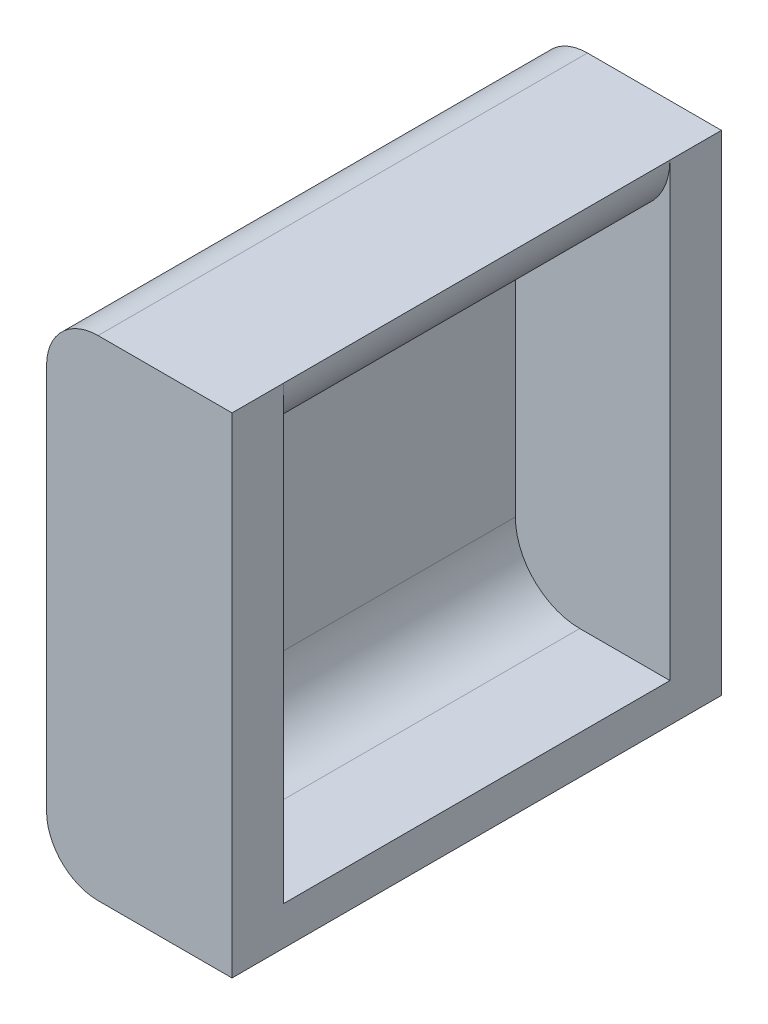
ISO-10303-21;
HEADER;
FILE_DESCRIPTION(('STEP AP214'),'2;1');
FILE_NAME('part.step','',(''),(''),'','','');
FILE_SCHEMA(('AUTOMOTIVE_DESIGN { 1 0 10303 214 1 1 1 1 }'));
ENDSEC;
DATA;
#1=APPLICATION_CONTEXT('core data for automotive mechanical design processes');
#2=APPLICATION_PROTOCOL_DEFINITION('international standard','automotive_design',2000,#1);
#3=PRODUCT_CONTEXT('',#1,'mechanical');
#4=PRODUCT('Part','Part','',(#3));
#5=PRODUCT_RELATED_PRODUCT_CATEGORY('part','',(#4));
#6=PRODUCT_DEFINITION_FORMATION('','',#4);
#7=PRODUCT_DEFINITION_CONTEXT('part definition',#1,'design');
#8=PRODUCT_DEFINITION('design','',#6,#7);
#9=PRODUCT_DEFINITION_SHAPE('','',#8);
#10=(LENGTH_UNIT() NAMED_UNIT(*) SI_UNIT(.MILLI.,.METRE.));
#11=(NAMED_UNIT(*) PLANE_ANGLE_UNIT() SI_UNIT($,.RADIAN.));
#12=(NAMED_UNIT(*) SI_UNIT($,.STERADIAN.) SOLID_ANGLE_UNIT());
#13=UNCERTAINTY_MEASURE_WITH_UNIT(LENGTH_MEASURE(1.E-05),#10,'distance_accuracy_value','');
#14=(GEOMETRIC_REPRESENTATION_CONTEXT(3) GLOBAL_UNCERTAINTY_ASSIGNED_CONTEXT((#13)) GLOBAL_UNIT_ASSIGNED_CONTEXT((#10,
#11,#12)) REPRESENTATION_CONTEXT('',''));
#15=CARTESIAN_POINT('',(0.,0.,0.));
#16=DIRECTION('',(0.,0.,1.));
#17=DIRECTION('',(1.,0.,0.));
#18=AXIS2_PLACEMENT_3D('',#15,#16,#17);
#19=CARTESIAN_POINT('',(-24.257,-43.6245,-19.05));
#20=DIRECTION('',(0.,0.,1.));
#21=DIRECTION('',(1.,0.,0.));
#22=AXIS2_PLACEMENT_3D('',#19,#20,#21);
#23=CYLINDRICAL_SURFACE('',#22,3.175);
#24=CARTESIAN_POINT('',(-24.257,-43.6245,0.));
#25=DIRECTION('',(0.,0.,1.));
#26=DIRECTION('',(1.,0.,0.));
#27=AXIS2_PLACEMENT_3D('',#24,#25,#26);
#28=CIRCLE('',#27,3.175);
#29=CARTESIAN_POINT('',(-27.432,-43.6245,0.));
#30=VERTEX_POINT('',#29);
#31=CARTESIAN_POINT('',(-24.257,-46.7995,0.));
#32=VERTEX_POINT('',#31);
#33=EDGE_CURVE('E221',#30,#32,#28,.T.);
#34=ORIENTED_EDGE('',*,*,#33,.T.);
#35=DIRECTION('',(0.,0.,1.));
#36=VECTOR('',#35,1.);
#37=CARTESIAN_POINT('',(-24.257,-46.7995,-19.05));
#38=LINE('',#37,#36);
#39=CARTESIAN_POINT('',(-24.257,-46.7995,-19.05));
#40=VERTEX_POINT('',#39);
#41=EDGE_CURVE('E268',#40,#32,#38,.T.);
#42=ORIENTED_EDGE('',*,*,#41,.F.);
#43=CARTESIAN_POINT('',(-24.257,-43.6245,-19.05));
#44=DIRECTION('',(0.,0.,1.));
#45=DIRECTION('',(1.,0.,0.));
#46=AXIS2_PLACEMENT_3D('',#43,#44,#45);
#47=CIRCLE('',#46,3.175);
#48=CARTESIAN_POINT('',(-27.432,-43.6245,-19.05));
#49=VERTEX_POINT('',#48);
#50=EDGE_CURVE('E222',#49,#40,#47,.T.);
#51=ORIENTED_EDGE('',*,*,#50,.F.);
#52=DIRECTION('',(0.,0.,1.));
#53=VECTOR('',#52,1.);
#54=CARTESIAN_POINT('',(-27.432,-43.6245,-19.05));
#55=LINE('',#54,#53);
#56=EDGE_CURVE('E246',#49,#30,#55,.T.);
#57=ORIENTED_EDGE('',*,*,#56,.T.);
#58=EDGE_LOOP('',(#34,#42,#51,#57));
#59=FACE_BOUND('',#58,.T.);
#60=ADVANCED_FACE('F42',(#59),#23,.F.);
#61=CARTESIAN_POINT('',(0.,-46.7995,-19.05));
#62=DIRECTION('',(0.,-1.,0.));
#63=DIRECTION('',(0.,0.,-1.));
#64=AXIS2_PLACEMENT_3D('',#61,#62,#63);
#65=PLANE('',#64);
#66=DIRECTION('',(1.,0.,0.));
#67=VECTOR('',#66,1.);
#68=CARTESIAN_POINT('',(0.,-46.7995,0.));
#69=LINE('',#68,#67);
#70=CARTESIAN_POINT('',(-19.812,-46.7995,0.));
#71=VERTEX_POINT('',#70);
#72=EDGE_CURVE('E226',#32,#71,#69,.T.);
#73=ORIENTED_EDGE('',*,*,#72,.T.);
#74=DIRECTION('',(0.,0.,1.));
#75=VECTOR('',#74,1.);
#76=CARTESIAN_POINT('',(-19.812,-46.7995,-19.05));
#77=LINE('',#76,#75);
#78=CARTESIAN_POINT('',(-19.812,-46.7995,-19.05));
#79=VERTEX_POINT('',#78);
#80=EDGE_CURVE('E174',#79,#71,#77,.T.);
#81=ORIENTED_EDGE('',*,*,#80,.F.);
#82=DIRECTION('',(1.,0.,0.));
#83=VECTOR('',#82,1.);
#84=CARTESIAN_POINT('',(0.,-46.7995,-19.05));
#85=LINE('',#84,#83);
#86=EDGE_CURVE('E242',#40,#79,#85,.T.);
#87=ORIENTED_EDGE('',*,*,#86,.F.);
#88=ORIENTED_EDGE('',*,*,#41,.T.);
#89=EDGE_LOOP('',(#73,#81,#87,#88));
#90=FACE_BOUND('',#89,.T.);
#91=ADVANCED_FACE('F333',(#90),#65,.F.);
#92=CARTESIAN_POINT('',(-19.812,0.,-19.05));
#93=DIRECTION('',(-1.,0.,0.));
#94=DIRECTION('',(0.,-1.,0.));
#95=AXIS2_PLACEMENT_3D('',#92,#93,#94);
#96=PLANE('',#95);
#97=ORIENTED_EDGE('',*,*,#80,.T.);
#98=DIRECTION('',(0.,1.,0.));
#99=VECTOR('',#98,1.);
#100=CARTESIAN_POINT('',(-19.812,0.,0.));
#101=LINE('',#100,#99);
#102=CARTESIAN_POINT('',(-19.812,-24.5745,0.));
#103=VERTEX_POINT('',#102);
#104=EDGE_CURVE('E200',#71,#103,#101,.T.);
#105=ORIENTED_EDGE('',*,*,#104,.T.);
#106=DIRECTION('',(0.,0.,-1.));
#107=VECTOR('',#106,1.);
#108=CARTESIAN_POINT('',(-19.812,-24.5745,2.54));
#109=LINE('',#108,#107);
#110=CARTESIAN_POINT('',(-19.812,-24.5745,2.54));
#111=VERTEX_POINT('',#110);
#112=EDGE_CURVE('E214',#111,#103,#109,.T.);
#113=ORIENTED_EDGE('',*,*,#112,.F.);
#114=DIRECTION('',(0.,1.,0.));
#115=VECTOR('',#114,1.);
#116=CARTESIAN_POINT('',(-19.812,0.,2.54));
#117=LINE('',#116,#115);
#118=CARTESIAN_POINT('',(-19.812,-48.7045,2.54));
#119=VERTEX_POINT('',#118);
#120=EDGE_CURVE('E172',#119,#111,#117,.T.);
#121=ORIENTED_EDGE('',*,*,#120,.F.);
#122=DIRECTION('',(0.,0.,1.));
#123=VECTOR('',#122,1.);
#124=CARTESIAN_POINT('',(-19.812,-48.7045,-19.05));
#125=LINE('',#124,#123);
#126=CARTESIAN_POINT('',(-19.812,-48.7045,-21.59));
#127=VERTEX_POINT('',#126);
#128=EDGE_CURVE('E164',#127,#119,#125,.T.);
#129=ORIENTED_EDGE('',*,*,#128,.F.);
#130=DIRECTION('',(0.,-1.,0.));
#131=VECTOR('',#130,1.);
#132=CARTESIAN_POINT('',(-19.812,0.,-21.59));
#133=LINE('',#132,#131);
#134=CARTESIAN_POINT('',(-19.812,-24.5745,-21.59));
#135=VERTEX_POINT('',#134);
#136=EDGE_CURVE('E169',#135,#127,#133,.T.);
#137=ORIENTED_EDGE('',*,*,#136,.F.);
#138=DIRECTION('',(0.,0.,1.));
#139=VECTOR('',#138,1.);
#140=CARTESIAN_POINT('',(-19.812,-24.5745,-21.59));
#141=LINE('',#140,#139);
#142=CARTESIAN_POINT('',(-19.812,-24.5745,-19.05));
#143=VERTEX_POINT('',#142);
#144=EDGE_CURVE('E196',#135,#143,#141,.T.);
#145=ORIENTED_EDGE('',*,*,#144,.T.);
#146=DIRECTION('',(0.,-1.,0.));
#147=VECTOR('',#146,1.);
#148=CARTESIAN_POINT('',(-19.812,0.,-19.05));
#149=LINE('',#148,#147);
#150=EDGE_CURVE('E186',#143,#79,#149,.T.);
#151=ORIENTED_EDGE('',*,*,#150,.T.);
#152=EDGE_LOOP('',(#97,#105,#113,#121,#129,#137,#145,#151));
#153=FACE_BOUND('',#152,.T.);
#154=ADVANCED_FACE('F166',(#153),#96,.F.);
#155=CARTESIAN_POINT('',(0.,-48.7045,-19.05));
#156=DIRECTION('',(0.,1.,0.));
#157=DIRECTION('',(0.,0.,1.));
#158=AXIS2_PLACEMENT_3D('',#155,#156,#157);
#159=PLANE('',#158);
#160=DIRECTION('',(1.,0.,0.));
#161=VECTOR('',#160,1.);
#162=CARTESIAN_POINT('',(0.,-48.7045,2.54));
#163=LINE('',#162,#161);
#164=CARTESIAN_POINT('',(-26.416,-48.7045,2.54));
#165=VERTEX_POINT('',#164);
#166=EDGE_CURVE('E211',#165,#119,#163,.T.);
#167=ORIENTED_EDGE('',*,*,#166,.F.);
#168=DIRECTION('',(0.,0.,1.));
#169=VECTOR('',#168,1.);
#170=CARTESIAN_POINT('',(-26.416,-48.7045,-19.05));
#171=LINE('',#170,#169);
#172=CARTESIAN_POINT('',(-26.416,-48.7045,-21.59));
#173=VERTEX_POINT('',#172);
#174=EDGE_CURVE('E69',#165,#173,#171,.F.);
#175=ORIENTED_EDGE('',*,*,#174,.T.);
#176=DIRECTION('',(-1.,0.,0.));
#177=VECTOR('',#176,1.);
#178=CARTESIAN_POINT('',(0.,-48.7045,-21.59));
#179=LINE('',#178,#177);
#180=EDGE_CURVE('E177',#127,#173,#179,.T.);
#181=ORIENTED_EDGE('',*,*,#180,.F.);
#182=ORIENTED_EDGE('',*,*,#128,.T.);
#183=EDGE_LOOP('',(#167,#175,#181,#182));
#184=FACE_BOUND('',#183,.T.);
#185=ADVANCED_FACE('F178',(#184),#159,.F.);
#186=CARTESIAN_POINT('',(-28.956,0.,-19.05));
#187=DIRECTION('',(1.,0.,0.));
#188=DIRECTION('',(0.,0.,-1.));
#189=AXIS2_PLACEMENT_3D('',#186,#187,#188);
#190=PLANE('',#189);
#191=DIRECTION('',(0.,1.,0.));
#192=VECTOR('',#191,1.);
#193=CARTESIAN_POINT('',(-28.956,0.,-21.59));
#194=LINE('',#193,#192);
#195=CARTESIAN_POINT('',(-28.956,-46.1645,-21.59));
#196=VERTEX_POINT('',#195);
#197=CARTESIAN_POINT('',(-28.956,-27.1145,-21.59));
#198=VERTEX_POINT('',#197);
#199=EDGE_CURVE('E180',#196,#198,#194,.T.);
#200=ORIENTED_EDGE('',*,*,#199,.F.);
#201=DIRECTION('',(0.,0.,1.));
#202=VECTOR('',#201,1.);
#203=CARTESIAN_POINT('',(-28.956,-46.1645,-19.05));
#204=LINE('',#203,#202);
#205=CARTESIAN_POINT('',(-28.956,-46.1645,2.54));
#206=VERTEX_POINT('',#205);
#207=EDGE_CURVE('E295',#196,#206,#204,.T.);
#208=ORIENTED_EDGE('',*,*,#207,.T.);
#209=DIRECTION('',(0.,-1.,0.));
#210=VECTOR('',#209,1.);
#211=CARTESIAN_POINT('',(-28.956,0.,2.54));
#212=LINE('',#211,#210);
#213=CARTESIAN_POINT('',(-28.956,-27.1145,2.54));
#214=VERTEX_POINT('',#213);
#215=EDGE_CURVE('E207',#214,#206,#212,.T.);
#216=ORIENTED_EDGE('',*,*,#215,.F.);
#217=DIRECTION('',(0.,0.,1.));
#218=VECTOR('',#217,1.);
#219=CARTESIAN_POINT('',(-28.956,-27.1145,-19.05));
#220=LINE('',#219,#218);
#221=EDGE_CURVE('E272',#214,#198,#220,.F.);
#222=ORIENTED_EDGE('',*,*,#221,.T.);
#223=EDGE_LOOP('',(#200,#208,#216,#222));
#224=FACE_BOUND('',#223,.T.);
#225=ADVANCED_FACE('F312',(#224),#190,.F.);
#226=CARTESIAN_POINT('',(0.,-24.5745,-19.05));
#227=DIRECTION('',(0.,-1.,0.));
#228=DIRECTION('',(0.,0.,-1.));
#229=AXIS2_PLACEMENT_3D('',#226,#227,#228);
#230=PLANE('',#229);
#231=DIRECTION('',(1.,0.,0.));
#232=VECTOR('',#231,1.);
#233=CARTESIAN_POINT('',(0.,-24.5745,-21.59));
#234=LINE('',#233,#232);
#235=CARTESIAN_POINT('',(-26.416,-24.5745,-21.59));
#236=VERTEX_POINT('',#235);
#237=EDGE_CURVE('E183',#236,#135,#234,.T.);
#238=ORIENTED_EDGE('',*,*,#237,.F.);
#239=DIRECTION('',(0.,0.,1.));
#240=VECTOR('',#239,1.);
#241=CARTESIAN_POINT('',(-26.416,-24.5745,-19.05));
#242=LINE('',#241,#240);
#243=CARTESIAN_POINT('',(-26.416,-24.5745,2.54));
#244=VERTEX_POINT('',#243);
#245=EDGE_CURVE('E11',#236,#244,#242,.T.);
#246=ORIENTED_EDGE('',*,*,#245,.T.);
#247=DIRECTION('',(-1.,0.,0.));
#248=VECTOR('',#247,1.);
#249=CARTESIAN_POINT('',(0.,-24.5745,2.54));
#250=LINE('',#249,#248);
#251=EDGE_CURVE('E203',#111,#244,#250,.T.);
#252=ORIENTED_EDGE('',*,*,#251,.F.);
#253=ORIENTED_EDGE('',*,*,#112,.T.);
#254=DIRECTION('',(0.,0.,1.));
#255=VECTOR('',#254,1.);
#256=CARTESIAN_POINT('',(-19.812,-24.5745,-19.05));
#257=LINE('',#256,#255);
#258=EDGE_CURVE('E175',#143,#103,#257,.T.);
#259=ORIENTED_EDGE('',*,*,#258,.F.);
#260=ORIENTED_EDGE('',*,*,#144,.F.);
#261=EDGE_LOOP('',(#238,#246,#252,#253,#259,#260));
#262=FACE_BOUND('',#261,.T.);
#263=ADVANCED_FACE('F321',(#262),#230,.F.);
#264=CARTESIAN_POINT('',(-22.987,-24.5745,-19.05));
#265=DIRECTION('',(0.,0.,1.));
#266=DIRECTION('',(1.,0.,0.));
#267=AXIS2_PLACEMENT_3D('',#264,#265,#266);
#268=CYLINDRICAL_SURFACE('',#267,3.175);
#269=CARTESIAN_POINT('',(-22.987,-24.5745,0.));
#270=DIRECTION('',(0.,0.,1.));
#271=DIRECTION('',(1.,0.,0.));
#272=AXIS2_PLACEMENT_3D('',#269,#270,#271);
#273=CIRCLE('',#272,3.175);
#274=CARTESIAN_POINT('',(-22.987,-27.7495,0.));
#275=VERTEX_POINT('',#274);
#276=EDGE_CURVE('E262',#275,#103,#273,.T.);
#277=ORIENTED_EDGE('',*,*,#276,.F.);
#278=DIRECTION('',(0.,0.,1.));
#279=VECTOR('',#278,1.);
#280=CARTESIAN_POINT('',(-22.987,-27.7495,-19.05));
#281=LINE('',#280,#279);
#282=CARTESIAN_POINT('',(-22.987,-27.7495,-19.05));
#283=VERTEX_POINT('',#282);
#284=EDGE_CURVE('E278',#283,#275,#281,.T.);
#285=ORIENTED_EDGE('',*,*,#284,.F.);
#286=CARTESIAN_POINT('',(-22.987,-24.5745,-19.05));
#287=DIRECTION('',(0.,0.,1.));
#288=DIRECTION('',(1.,0.,0.));
#289=AXIS2_PLACEMENT_3D('',#286,#287,#288);
#290=CIRCLE('',#289,3.175);
#291=EDGE_CURVE('E238',#283,#143,#290,.T.);
#292=ORIENTED_EDGE('',*,*,#291,.T.);
#293=ORIENTED_EDGE('',*,*,#258,.T.);
#294=EDGE_LOOP('',(#277,#285,#292,#293));
#295=FACE_BOUND('',#294,.T.);
#296=ADVANCED_FACE('F324',(#295),#268,.T.);
#297=CARTESIAN_POINT('',(-1.51614831800374E-13,-27.7495000000001,-19.05));
#298=DIRECTION('',(0.,1.,0.));
#299=DIRECTION('',(-1.,0.,0.));
#300=AXIS2_PLACEMENT_3D('',#297,#298,#299);
#301=PLANE('',#300);
#302=DIRECTION('',(-1.,0.,0.));
#303=VECTOR('',#302,1.);
#304=CARTESIAN_POINT('',(-1.51614831800374E-13,-27.7495000000001,0.));
#305=LINE('',#304,#303);
#306=CARTESIAN_POINT('',(-24.257,-27.7495,0.));
#307=VERTEX_POINT('',#306);
#308=EDGE_CURVE('E258',#275,#307,#305,.T.);
#309=ORIENTED_EDGE('',*,*,#308,.T.);
#310=DIRECTION('',(0.,0.,1.));
#311=VECTOR('',#310,1.);
#312=CARTESIAN_POINT('',(-24.257,-27.7495,-19.05));
#313=LINE('',#312,#311);
#314=CARTESIAN_POINT('',(-24.257,-27.7495,-19.05));
#315=VERTEX_POINT('',#314);
#316=EDGE_CURVE('E282',#315,#307,#313,.T.);
#317=ORIENTED_EDGE('',*,*,#316,.F.);
#318=DIRECTION('',(-1.,0.,0.));
#319=VECTOR('',#318,1.);
#320=CARTESIAN_POINT('',(-1.51614831800374E-13,-27.7495000000001,-19.05));
#321=LINE('',#320,#319);
#322=EDGE_CURVE('E234',#283,#315,#321,.T.);
#323=ORIENTED_EDGE('',*,*,#322,.F.);
#324=ORIENTED_EDGE('',*,*,#284,.T.);
#325=EDGE_LOOP('',(#309,#317,#323,#324));
#326=FACE_BOUND('',#325,.T.);
#327=ADVANCED_FACE('F344',(#326),#301,.F.);
#328=CARTESIAN_POINT('',(-24.257,-30.9245,-19.05));
#329=DIRECTION('',(0.,0.,1.));
#330=DIRECTION('',(1.,0.,0.));
#331=AXIS2_PLACEMENT_3D('',#328,#329,#330);
#332=CYLINDRICAL_SURFACE('',#331,3.175);
#333=CARTESIAN_POINT('',(-24.257,-30.9245,0.));
#334=DIRECTION('',(0.,0.,1.));
#335=DIRECTION('',(1.,0.,0.));
#336=AXIS2_PLACEMENT_3D('',#333,#334,#335);
#337=CIRCLE('',#336,3.175);
#338=CARTESIAN_POINT('',(-27.432,-30.9245,0.));
#339=VERTEX_POINT('',#338);
#340=EDGE_CURVE('E254',#307,#339,#337,.T.);
#341=ORIENTED_EDGE('',*,*,#340,.T.);
#342=DIRECTION('',(0.,0.,1.));
#343=VECTOR('',#342,1.);
#344=CARTESIAN_POINT('',(-27.432,-30.9245,-19.05));
#345=LINE('',#344,#343);
#346=CARTESIAN_POINT('',(-27.432,-30.9245,-19.05));
#347=VERTEX_POINT('',#346);
#348=EDGE_CURVE('E286',#347,#339,#345,.T.);
#349=ORIENTED_EDGE('',*,*,#348,.F.);
#350=CARTESIAN_POINT('',(-24.257,-30.9245,-19.05));
#351=DIRECTION('',(0.,0.,1.));
#352=DIRECTION('',(1.,0.,0.));
#353=AXIS2_PLACEMENT_3D('',#350,#351,#352);
#354=CIRCLE('',#353,3.175);
#355=EDGE_CURVE('E230',#315,#347,#354,.T.);
#356=ORIENTED_EDGE('',*,*,#355,.F.);
#357=ORIENTED_EDGE('',*,*,#316,.T.);
#358=EDGE_LOOP('',(#341,#349,#356,#357));
#359=FACE_BOUND('',#358,.T.);
#360=ADVANCED_FACE('F342',(#359),#332,.F.);
#361=CARTESIAN_POINT('',(-27.432,0.,-19.05));
#362=DIRECTION('',(-1.,0.,0.));
#363=DIRECTION('',(0.,-1.,0.));
#364=AXIS2_PLACEMENT_3D('',#361,#362,#363);
#365=PLANE('',#364);
#366=DIRECTION('',(0.,-1.,0.));
#367=VECTOR('',#366,1.);
#368=CARTESIAN_POINT('',(-27.432,0.,0.));
#369=LINE('',#368,#367);
#370=EDGE_CURVE('E250',#339,#30,#369,.T.);
#371=ORIENTED_EDGE('',*,*,#370,.T.);
#372=ORIENTED_EDGE('',*,*,#56,.F.);
#373=DIRECTION('',(0.,-1.,0.));
#374=VECTOR('',#373,1.);
#375=CARTESIAN_POINT('',(-27.432,0.,-19.05));
#376=LINE('',#375,#374);
#377=EDGE_CURVE('E225',#347,#49,#376,.T.);
#378=ORIENTED_EDGE('',*,*,#377,.F.);
#379=ORIENTED_EDGE('',*,*,#348,.T.);
#380=EDGE_LOOP('',(#371,#372,#378,#379));
#381=FACE_BOUND('',#380,.T.);
#382=ADVANCED_FACE('F338',(#381),#365,.F.);
#383=CARTESIAN_POINT('',(0.,0.,0.));
#384=DIRECTION('',(0.,0.,1.));
#385=DIRECTION('',(1.,0.,0.));
#386=AXIS2_PLACEMENT_3D('',#383,#384,#385);
#387=PLANE('',#386);
#388=ORIENTED_EDGE('',*,*,#308,.F.);
#389=ORIENTED_EDGE('',*,*,#276,.T.);
#390=ORIENTED_EDGE('',*,*,#104,.F.);
#391=ORIENTED_EDGE('',*,*,#72,.F.);
#392=ORIENTED_EDGE('',*,*,#33,.F.);
#393=ORIENTED_EDGE('',*,*,#370,.F.);
#394=ORIENTED_EDGE('',*,*,#340,.F.);
#395=EDGE_LOOP('',(#388,#389,#390,#391,#392,#393,#394));
#396=FACE_BOUND('',#395,.T.);
#397=ADVANCED_FACE('F336',(#396),#387,.F.);
#398=CARTESIAN_POINT('',(0.,0.,2.54));
#399=DIRECTION('',(0.,0.,1.));
#400=DIRECTION('',(1.,0.,0.));
#401=AXIS2_PLACEMENT_3D('',#398,#399,#400);
#402=PLANE('',#401);
#403=ORIENTED_EDGE('',*,*,#215,.T.);
#404=CARTESIAN_POINT('',(-26.416,-46.1645,2.54));
#405=DIRECTION('',(0.,0.,1.));
#406=DIRECTION('',(1.,0.,0.));
#407=AXIS2_PLACEMENT_3D('',#404,#405,#406);
#408=CIRCLE('',#407,2.54);
#409=EDGE_CURVE('E302',#206,#165,#408,.T.);
#410=ORIENTED_EDGE('',*,*,#409,.T.);
#411=ORIENTED_EDGE('',*,*,#166,.T.);
#412=ORIENTED_EDGE('',*,*,#120,.T.);
#413=ORIENTED_EDGE('',*,*,#251,.T.);
#414=CARTESIAN_POINT('',(-26.416,-27.1145,2.54));
#415=DIRECTION('',(0.,0.,1.));
#416=DIRECTION('',(1.,0.,0.));
#417=AXIS2_PLACEMENT_3D('',#414,#415,#416);
#418=CIRCLE('',#417,2.54);
#419=EDGE_CURVE('E299',#244,#214,#418,.T.);
#420=ORIENTED_EDGE('',*,*,#419,.T.);
#421=EDGE_LOOP('',(#403,#410,#411,#412,#413,#420));
#422=FACE_BOUND('',#421,.T.);
#423=ADVANCED_FACE('F317',(#422),#402,.T.);
#424=CARTESIAN_POINT('',(0.,0.,-19.05));
#425=DIRECTION('',(0.,0.,-1.));
#426=DIRECTION('',(-1.,0.,0.));
#427=AXIS2_PLACEMENT_3D('',#424,#425,#426);
#428=PLANE('',#427);
#429=ORIENTED_EDGE('',*,*,#50,.T.);
#430=ORIENTED_EDGE('',*,*,#86,.T.);
#431=ORIENTED_EDGE('',*,*,#150,.F.);
#432=ORIENTED_EDGE('',*,*,#291,.F.);
#433=ORIENTED_EDGE('',*,*,#322,.T.);
#434=ORIENTED_EDGE('',*,*,#355,.T.);
#435=ORIENTED_EDGE('',*,*,#377,.T.);
#436=EDGE_LOOP('',(#429,#430,#431,#432,#433,#434,#435));
#437=FACE_BOUND('',#436,.T.);
#438=ADVANCED_FACE('F329',(#437),#428,.F.);
#439=CARTESIAN_POINT('',(0.,0.,-21.59));
#440=DIRECTION('',(0.,0.,-1.));
#441=DIRECTION('',(-1.,0.,0.));
#442=AXIS2_PLACEMENT_3D('',#439,#440,#441);
#443=PLANE('',#442);
#444=ORIENTED_EDGE('',*,*,#180,.T.);
#445=CARTESIAN_POINT('',(-26.416,-46.1645,-21.59));
#446=DIRECTION('',(0.,0.,-1.));
#447=DIRECTION('',(-1.,0.,0.));
#448=AXIS2_PLACEMENT_3D('',#445,#446,#447);
#449=CIRCLE('',#448,2.54);
#450=EDGE_CURVE('E51',#173,#196,#449,.T.);
#451=ORIENTED_EDGE('',*,*,#450,.T.);
#452=ORIENTED_EDGE('',*,*,#199,.T.);
#453=CARTESIAN_POINT('',(-26.416,-27.1145,-21.59));
#454=DIRECTION('',(0.,0.,-1.));
#455=DIRECTION('',(-1.,0.,0.));
#456=AXIS2_PLACEMENT_3D('',#453,#454,#455);
#457=CIRCLE('',#456,2.54);
#458=EDGE_CURVE('E61',#198,#236,#457,.T.);
#459=ORIENTED_EDGE('',*,*,#458,.T.);
#460=ORIENTED_EDGE('',*,*,#237,.T.);
#461=ORIENTED_EDGE('',*,*,#136,.T.);
#462=EDGE_LOOP('',(#444,#451,#452,#459,#460,#461));
#463=FACE_BOUND('',#462,.T.);
#464=ADVANCED_FACE('F182',(#463),#443,.T.);
#465=CARTESIAN_POINT('',(-26.416,-46.1645,-19.05));
#466=DIRECTION('',(0.,0.,1.));
#467=DIRECTION('',(1.,0.,0.));
#468=AXIS2_PLACEMENT_3D('',#465,#466,#467);
#469=CYLINDRICAL_SURFACE('',#468,2.54);
#470=ORIENTED_EDGE('',*,*,#450,.F.);
#471=ORIENTED_EDGE('',*,*,#174,.F.);
#472=ORIENTED_EDGE('',*,*,#409,.F.);
#473=ORIENTED_EDGE('',*,*,#207,.F.);
#474=EDGE_LOOP('',(#470,#471,#472,#473));
#475=FACE_BOUND('',#474,.T.);
#476=ADVANCED_FACE('F315',(#475),#469,.T.);
#477=CARTESIAN_POINT('',(-26.416,-27.1145,-19.05));
#478=DIRECTION('',(0.,0.,1.));
#479=DIRECTION('',(1.,0.,0.));
#480=AXIS2_PLACEMENT_3D('',#477,#478,#479);
#481=CYLINDRICAL_SURFACE('',#480,2.54);
#482=ORIENTED_EDGE('',*,*,#458,.F.);
#483=ORIENTED_EDGE('',*,*,#221,.F.);
#484=ORIENTED_EDGE('',*,*,#419,.F.);
#485=ORIENTED_EDGE('',*,*,#245,.F.);
#486=EDGE_LOOP('',(#482,#483,#484,#485));
#487=FACE_BOUND('',#486,.T.);
#488=ADVANCED_FACE('F44',(#487),#481,.T.);
#489=CLOSED_SHELL('',(#60,#91,#154,#185,#225,#263,#296,#327,#360,#382,#397,#423,#438,#464,#476,#488));
#490=MANIFOLD_SOLID_BREP('B2',#489);
#491=ADVANCED_BREP_SHAPE_REPRESENTATION('',(#18,#490),#14);
#492=SHAPE_DEFINITION_REPRESENTATION(#9,#491);
ENDSEC;
END-ISO-10303-21;
